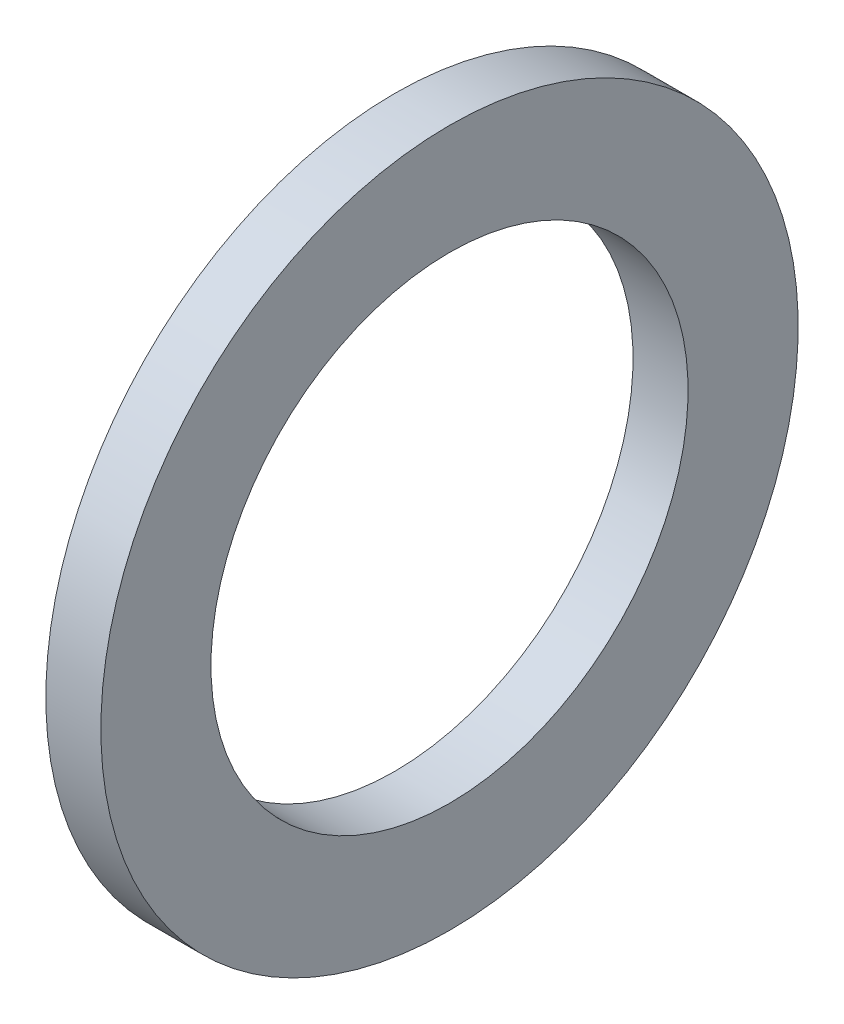
ISO-10303-21;
HEADER;
FILE_DESCRIPTION(('STEP AP214'),'2;1');
FILE_NAME('part.step','',(''),(''),'','','');
FILE_SCHEMA(('AUTOMOTIVE_DESIGN { 1 0 10303 214 1 1 1 1 }'));
ENDSEC;
DATA;
#1=APPLICATION_CONTEXT('core data for automotive mechanical design processes');
#2=APPLICATION_PROTOCOL_DEFINITION('international standard','automotive_design',2000,#1);
#3=PRODUCT_CONTEXT('',#1,'mechanical');
#4=PRODUCT('Part','Part','',(#3));
#5=PRODUCT_RELATED_PRODUCT_CATEGORY('part','',(#4));
#6=PRODUCT_DEFINITION_FORMATION('','',#4);
#7=PRODUCT_DEFINITION_CONTEXT('part definition',#1,'design');
#8=PRODUCT_DEFINITION('design','',#6,#7);
#9=PRODUCT_DEFINITION_SHAPE('','',#8);
#10=(LENGTH_UNIT() NAMED_UNIT(*) SI_UNIT(.MILLI.,.METRE.));
#11=(NAMED_UNIT(*) PLANE_ANGLE_UNIT() SI_UNIT($,.RADIAN.));
#12=(NAMED_UNIT(*) SI_UNIT($,.STERADIAN.) SOLID_ANGLE_UNIT());
#13=UNCERTAINTY_MEASURE_WITH_UNIT(LENGTH_MEASURE(1.E-05),#10,'distance_accuracy_value','');
#14=(GEOMETRIC_REPRESENTATION_CONTEXT(3) GLOBAL_UNCERTAINTY_ASSIGNED_CONTEXT((#13)) GLOBAL_UNIT_ASSIGNED_CONTEXT((#10,
#11,#12)) REPRESENTATION_CONTEXT('',''));
#15=CARTESIAN_POINT('',(0.,0.,0.));
#16=DIRECTION('',(0.,0.,1.));
#17=DIRECTION('',(1.,0.,0.));
#18=AXIS2_PLACEMENT_3D('',#15,#16,#17);
#19=CARTESIAN_POINT('',(0.,0.,0.));
#20=DIRECTION('',(-1.,0.,0.));
#21=DIRECTION('',(0.,0.,1.));
#22=AXIS2_PLACEMENT_3D('',#19,#20,#21);
#23=PLANE('',#22);
#24=CARTESIAN_POINT('',(0.,0.,0.));
#25=DIRECTION('',(1.,0.,0.));
#26=DIRECTION('',(0.,-1.,0.));
#27=AXIS2_PLACEMENT_3D('',#24,#25,#26);
#28=CIRCLE('',#27,6.5);
#29=CARTESIAN_POINT('',(0.,6.5,0.));
#30=VERTEX_POINT('',#29);
#31=EDGE_CURVE('E56',#30,#30,#28,.T.);
#32=ORIENTED_EDGE('',*,*,#31,.T.);
#33=EDGE_LOOP('',(#32));
#34=FACE_BOUND('',#33,.T.);
#35=CARTESIAN_POINT('',(0.,0.,0.));
#36=DIRECTION('',(-1.,0.,0.));
#37=DIRECTION('',(0.,-1.,0.));
#38=AXIS2_PLACEMENT_3D('',#35,#36,#37);
#39=CIRCLE('',#38,9.5);
#40=CARTESIAN_POINT('',(0.,9.5,0.));
#41=VERTEX_POINT('',#40);
#42=EDGE_CURVE('E11',#41,#41,#39,.T.);
#43=ORIENTED_EDGE('',*,*,#42,.T.);
#44=EDGE_LOOP('',(#43));
#45=FACE_BOUND('',#44,.T.);
#46=ADVANCED_FACE('F17',(#34,#45),#23,.T.);
#47=CARTESIAN_POINT('',(1.5,0.,0.));
#48=DIRECTION('',(-1.,0.,0.));
#49=DIRECTION('',(0.,0.,1.));
#50=AXIS2_PLACEMENT_3D('',#47,#48,#49);
#51=PLANE('',#50);
#52=CARTESIAN_POINT('',(1.5,0.,0.));
#53=DIRECTION('',(-1.,0.,0.));
#54=DIRECTION('',(0.,-1.,0.));
#55=AXIS2_PLACEMENT_3D('',#52,#53,#54);
#56=CIRCLE('',#55,6.5);
#57=CARTESIAN_POINT('',(1.5,6.5,0.));
#58=VERTEX_POINT('',#57);
#59=EDGE_CURVE('E47',#58,#58,#56,.T.);
#60=ORIENTED_EDGE('',*,*,#59,.T.);
#61=EDGE_LOOP('',(#60));
#62=FACE_BOUND('',#61,.T.);
#63=CARTESIAN_POINT('',(1.5,0.,0.));
#64=DIRECTION('',(-1.,0.,0.));
#65=DIRECTION('',(0.,-1.,0.));
#66=AXIS2_PLACEMENT_3D('',#63,#64,#65);
#67=CIRCLE('',#66,9.5);
#68=CARTESIAN_POINT('',(1.5,9.5,0.));
#69=VERTEX_POINT('',#68);
#70=EDGE_CURVE('E65',#69,#69,#67,.T.);
#71=ORIENTED_EDGE('',*,*,#70,.F.);
#72=EDGE_LOOP('',(#71));
#73=FACE_BOUND('',#72,.T.);
#74=ADVANCED_FACE('F82',(#62,#73),#51,.F.);
#75=CARTESIAN_POINT('',(0.,0.,0.));
#76=DIRECTION('',(1.,0.,0.));
#77=DIRECTION('',(0.,-1.,0.));
#78=AXIS2_PLACEMENT_3D('',#75,#76,#77);
#79=CYLINDRICAL_SURFACE('',#78,9.5);
#80=ORIENTED_EDGE('',*,*,#70,.T.);
#81=DIRECTION('',(-1.,0.,0.));
#82=VECTOR('',#81,1.);
#83=CARTESIAN_POINT('',(0.,9.5,0.));
#84=LINE('',#83,#82);
#85=EDGE_CURVE('E21',#69,#41,#84,.T.);
#86=ORIENTED_EDGE('',*,*,#85,.T.);
#87=ORIENTED_EDGE('',*,*,#42,.F.);
#88=ORIENTED_EDGE('',*,*,#85,.F.);
#89=EDGE_LOOP('',(#80,#86,#87,#88));
#90=FACE_BOUND('',#89,.T.);
#91=ADVANCED_FACE('F80',(#90),#79,.T.);
#92=CARTESIAN_POINT('',(0.,0.,0.));
#93=DIRECTION('',(1.,0.,0.));
#94=DIRECTION('',(0.,-1.,0.));
#95=AXIS2_PLACEMENT_3D('',#92,#93,#94);
#96=CYLINDRICAL_SURFACE('',#95,6.5);
#97=ORIENTED_EDGE('',*,*,#31,.F.);
#98=DIRECTION('',(1.,0.,0.));
#99=VECTOR('',#98,1.);
#100=CARTESIAN_POINT('',(0.,6.5,0.));
#101=LINE('',#100,#99);
#102=EDGE_CURVE('E54',#30,#58,#101,.T.);
#103=ORIENTED_EDGE('',*,*,#102,.T.);
#104=ORIENTED_EDGE('',*,*,#59,.F.);
#105=ORIENTED_EDGE('',*,*,#102,.F.);
#106=EDGE_LOOP('',(#97,#103,#104,#105));
#107=FACE_BOUND('',#106,.T.);
#108=ADVANCED_FACE('F19',(#107),#96,.F.);
#109=CLOSED_SHELL('',(#46,#74,#91,#108));
#110=MANIFOLD_SOLID_BREP('B1',#109);
#111=ADVANCED_BREP_SHAPE_REPRESENTATION('',(#18,#110),#14);
#112=SHAPE_DEFINITION_REPRESENTATION(#9,#111);
ENDSEC;
END-ISO-10303-21;
